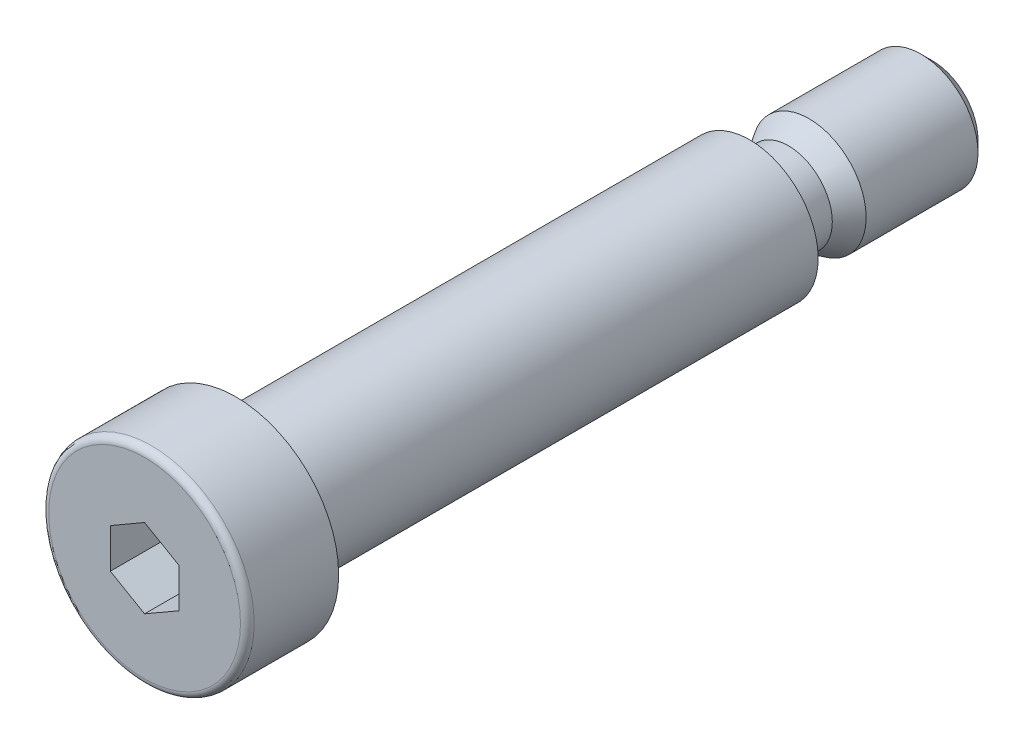
ISO-10303-21;
HEADER;
FILE_DESCRIPTION(('STEP AP214'),'2;1');
FILE_NAME('part.step','',(''),(''),'','','');
FILE_SCHEMA(('AUTOMOTIVE_DESIGN { 1 0 10303 214 1 1 1 1 }'));
ENDSEC;
DATA;
#1=APPLICATION_CONTEXT('core data for automotive mechanical design processes');
#2=APPLICATION_PROTOCOL_DEFINITION('international standard','automotive_design',2000,#1);
#3=PRODUCT_CONTEXT('',#1,'mechanical');
#4=PRODUCT('Part','Part','',(#3));
#5=PRODUCT_RELATED_PRODUCT_CATEGORY('part','',(#4));
#6=PRODUCT_DEFINITION_FORMATION('','',#4);
#7=PRODUCT_DEFINITION_CONTEXT('part definition',#1,'design');
#8=PRODUCT_DEFINITION('design','',#6,#7);
#9=PRODUCT_DEFINITION_SHAPE('','',#8);
#10=(LENGTH_UNIT() NAMED_UNIT(*) SI_UNIT(.MILLI.,.METRE.));
#11=(NAMED_UNIT(*) PLANE_ANGLE_UNIT() SI_UNIT($,.RADIAN.));
#12=(NAMED_UNIT(*) SI_UNIT($,.STERADIAN.) SOLID_ANGLE_UNIT());
#13=UNCERTAINTY_MEASURE_WITH_UNIT(LENGTH_MEASURE(1.E-05),#10,'distance_accuracy_value','');
#14=(GEOMETRIC_REPRESENTATION_CONTEXT(3) GLOBAL_UNCERTAINTY_ASSIGNED_CONTEXT((#13)) GLOBAL_UNIT_ASSIGNED_CONTEXT((#10,
#11,#12)) REPRESENTATION_CONTEXT('',''));
#15=CARTESIAN_POINT('',(0.,0.,0.));
#16=DIRECTION('',(0.,0.,1.));
#17=DIRECTION('',(1.,0.,0.));
#18=AXIS2_PLACEMENT_3D('',#15,#16,#17);
#19=CARTESIAN_POINT('',(0.,0.,30.5));
#20=DIRECTION('',(0.,0.,1.));
#21=DIRECTION('',(1.,0.,0.));
#22=AXIS2_PLACEMENT_3D('',#19,#20,#21);
#23=PLANE('',#22);
#24=CARTESIAN_POINT('',(0.,0.,30.5));
#25=DIRECTION('',(0.,0.,1.));
#26=DIRECTION('',(1.,0.,0.));
#27=AXIS2_PLACEMENT_3D('',#24,#25,#26);
#28=CIRCLE('',#27,8.4);
#29=CARTESIAN_POINT('',(8.4,0.,30.5));
#30=VERTEX_POINT('',#29);
#31=EDGE_CURVE('E42',#30,#30,#28,.T.);
#32=ORIENTED_EDGE('',*,*,#31,.T.);
#33=EDGE_LOOP('',(#32));
#34=FACE_BOUND('',#33,.T.);
#35=DIRECTION('',(0.,1.,0.));
#36=VECTOR('',#35,1.);
#37=CARTESIAN_POINT('',(3.,-1.73205080756888,30.5));
#38=LINE('',#37,#36);
#39=CARTESIAN_POINT('',(3.,-1.73205080756888,30.5));
#40=VERTEX_POINT('',#39);
#41=CARTESIAN_POINT('',(3.,1.73205080756888,30.5));
#42=VERTEX_POINT('',#41);
#43=EDGE_CURVE('E49',#40,#42,#38,.T.);
#44=ORIENTED_EDGE('',*,*,#43,.F.);
#45=DIRECTION('',(0.866025403784439,0.5,0.));
#46=VECTOR('',#45,1.);
#47=CARTESIAN_POINT('',(0.,-3.46410161513775,30.5));
#48=LINE('',#47,#46);
#49=CARTESIAN_POINT('',(0.,-3.46410161513775,30.5));
#50=VERTEX_POINT('',#49);
#51=EDGE_CURVE('E132',#50,#40,#48,.T.);
#52=ORIENTED_EDGE('',*,*,#51,.F.);
#53=DIRECTION('',(0.866025403784439,-0.5,0.));
#54=VECTOR('',#53,1.);
#55=CARTESIAN_POINT('',(-3.,-1.73205080756888,30.5));
#56=LINE('',#55,#54);
#57=CARTESIAN_POINT('',(-3.,-1.73205080756888,30.5));
#58=VERTEX_POINT('',#57);
#59=EDGE_CURVE('E130',#58,#50,#56,.T.);
#60=ORIENTED_EDGE('',*,*,#59,.F.);
#61=DIRECTION('',(0.,-1.,0.));
#62=VECTOR('',#61,1.);
#63=CARTESIAN_POINT('',(-3.,1.73205080756888,30.5));
#64=LINE('',#63,#62);
#65=CARTESIAN_POINT('',(-3.,1.73205080756888,30.5));
#66=VERTEX_POINT('',#65);
#67=EDGE_CURVE('E97',#66,#58,#64,.T.);
#68=ORIENTED_EDGE('',*,*,#67,.F.);
#69=DIRECTION('',(-0.866025403784439,-0.5,0.));
#70=VECTOR('',#69,1.);
#71=CARTESIAN_POINT('',(0.,3.46410161513775,30.5));
#72=LINE('',#71,#70);
#73=CARTESIAN_POINT('',(0.,3.46410161513775,30.5));
#74=VERTEX_POINT('',#73);
#75=EDGE_CURVE('E126',#74,#66,#72,.T.);
#76=ORIENTED_EDGE('',*,*,#75,.F.);
#77=DIRECTION('',(-0.866025403784439,0.5,0.));
#78=VECTOR('',#77,1.);
#79=CARTESIAN_POINT('',(3.,1.73205080756888,30.5));
#80=LINE('',#79,#78);
#81=EDGE_CURVE('E123',#42,#74,#80,.T.);
#82=ORIENTED_EDGE('',*,*,#81,.F.);
#83=EDGE_LOOP('',(#44,#52,#60,#68,#76,#82));
#84=FACE_BOUND('',#83,.T.);
#85=ADVANCED_FACE('F34',(#34,#84),#23,.T.);
#86=CARTESIAN_POINT('',(0.,0.,-38.5));
#87=DIRECTION('',(0.,0.,1.));
#88=DIRECTION('',(1.,0.,0.));
#89=AXIS2_PLACEMENT_3D('',#86,#87,#88);
#90=PLANE('',#89);
#91=CARTESIAN_POINT('',(0.,0.,-38.5));
#92=DIRECTION('',(0.,0.,1.));
#93=DIRECTION('',(1.,0.,0.));
#94=AXIS2_PLACEMENT_3D('',#91,#92,#93);
#95=CIRCLE('',#94,4.);
#96=CARTESIAN_POINT('',(4.,0.,-38.5));
#97=VERTEX_POINT('',#96);
#98=EDGE_CURVE('E162',#97,#97,#95,.T.);
#99=ORIENTED_EDGE('',*,*,#98,.F.);
#100=EDGE_LOOP('',(#99));
#101=FACE_BOUND('',#100,.T.);
#102=ADVANCED_FACE('F178',(#101),#90,.F.);
#103=CARTESIAN_POINT('',(0.,0.,-38.5));
#104=DIRECTION('',(0.,0.,1.));
#105=DIRECTION('',(1.,0.,0.));
#106=AXIS2_PLACEMENT_3D('',#103,#104,#105);
#107=CONICAL_SURFACE('',#106,4.,0.785398163397447);
#108=CARTESIAN_POINT('',(0.,0.,-37.5));
#109=DIRECTION('',(0.,0.,1.));
#110=DIRECTION('',(1.,0.,0.));
#111=AXIS2_PLACEMENT_3D('',#108,#109,#110);
#112=CIRCLE('',#111,5.);
#113=CARTESIAN_POINT('',(5.,0.,-37.5));
#114=VERTEX_POINT('',#113);
#115=EDGE_CURVE('E159',#114,#114,#112,.T.);
#116=ORIENTED_EDGE('',*,*,#115,.F.);
#117=EDGE_LOOP('',(#116));
#118=FACE_BOUND('',#117,.T.);
#119=ORIENTED_EDGE('',*,*,#98,.T.);
#120=EDGE_LOOP('',(#119));
#121=FACE_BOUND('',#120,.T.);
#122=ADVANCED_FACE('F182',(#118,#121),#107,.T.);
#123=CARTESIAN_POINT('',(0.,0.,30.5));
#124=DIRECTION('',(0.,0.,1.));
#125=DIRECTION('',(1.,0.,0.));
#126=AXIS2_PLACEMENT_3D('',#123,#124,#125);
#127=CYLINDRICAL_SURFACE('',#126,5.);
#128=CARTESIAN_POINT('',(0.,0.,-27.7));
#129=DIRECTION('',(0.,0.,1.));
#130=DIRECTION('',(1.,0.,0.));
#131=AXIS2_PLACEMENT_3D('',#128,#129,#130);
#132=CIRCLE('',#131,5.);
#133=CARTESIAN_POINT('',(5.,0.,-27.7));
#134=VERTEX_POINT('',#133);
#135=EDGE_CURVE('E156',#134,#134,#132,.T.);
#136=ORIENTED_EDGE('',*,*,#135,.F.);
#137=EDGE_LOOP('',(#136));
#138=FACE_BOUND('',#137,.T.);
#139=ORIENTED_EDGE('',*,*,#115,.T.);
#140=EDGE_LOOP('',(#139));
#141=FACE_BOUND('',#140,.T.);
#142=ADVANCED_FACE('F188',(#138,#141),#127,.T.);
#143=CARTESIAN_POINT('',(0.,0.,-27.7));
#144=DIRECTION('',(0.,0.,-1.));
#145=DIRECTION('',(-1.,0.,0.));
#146=AXIS2_PLACEMENT_3D('',#143,#144,#145);
#147=CONICAL_SURFACE('',#146,5.,0.566013910063241);
#148=CARTESIAN_POINT('',(0.,0.,-25.89));
#149=DIRECTION('',(0.,0.,1.));
#150=DIRECTION('',(1.,0.,0.));
#151=AXIS2_PLACEMENT_3D('',#148,#149,#150);
#152=CIRCLE('',#151,3.85000000000001);
#153=CARTESIAN_POINT('',(3.85000000000001,0.,-25.89));
#154=VERTEX_POINT('',#153);
#155=EDGE_CURVE('E153',#154,#154,#152,.T.);
#156=ORIENTED_EDGE('',*,*,#155,.F.);
#157=EDGE_LOOP('',(#156));
#158=FACE_BOUND('',#157,.T.);
#159=ORIENTED_EDGE('',*,*,#135,.T.);
#160=EDGE_LOOP('',(#159));
#161=FACE_BOUND('',#160,.T.);
#162=ADVANCED_FACE('F192',(#158,#161),#147,.T.);
#163=CARTESIAN_POINT('',(0.,0.,30.5));
#164=DIRECTION('',(0.,0.,1.));
#165=DIRECTION('',(1.,0.,0.));
#166=AXIS2_PLACEMENT_3D('',#163,#164,#165);
#167=CYLINDRICAL_SURFACE('',#166,3.85000000000001);
#168=ORIENTED_EDGE('',*,*,#155,.T.);
#169=EDGE_LOOP('',(#168));
#170=FACE_BOUND('',#169,.T.);
#171=CARTESIAN_POINT('',(0.,0.,-22.5));
#172=DIRECTION('',(0.,0.,1.));
#173=DIRECTION('',(1.,0.,0.));
#174=AXIS2_PLACEMENT_3D('',#171,#172,#173);
#175=CIRCLE('',#174,3.85000000000001);
#176=CARTESIAN_POINT('',(3.85000000000001,0.,-22.5));
#177=VERTEX_POINT('',#176);
#178=EDGE_CURVE('E150',#177,#177,#175,.T.);
#179=ORIENTED_EDGE('',*,*,#178,.F.);
#180=EDGE_LOOP('',(#179));
#181=FACE_BOUND('',#180,.T.);
#182=ADVANCED_FACE('F196',(#170,#181),#167,.T.);
#183=CARTESIAN_POINT('',(0.,0.,-22.5));
#184=DIRECTION('',(0.,0.,1.));
#185=DIRECTION('',(1.,0.,0.));
#186=AXIS2_PLACEMENT_3D('',#183,#184,#185);
#187=PLANE('',#186);
#188=CARTESIAN_POINT('',(0.,0.,-22.5));
#189=DIRECTION('',(0.,0.,1.));
#190=DIRECTION('',(1.,0.,0.));
#191=AXIS2_PLACEMENT_3D('',#188,#189,#190);
#192=CIRCLE('',#191,6.);
#193=CARTESIAN_POINT('',(6.,0.,-22.5));
#194=VERTEX_POINT('',#193);
#195=EDGE_CURVE('E147',#194,#194,#192,.T.);
#196=ORIENTED_EDGE('',*,*,#195,.F.);
#197=EDGE_LOOP('',(#196));
#198=FACE_BOUND('',#197,.T.);
#199=ORIENTED_EDGE('',*,*,#178,.T.);
#200=EDGE_LOOP('',(#199));
#201=FACE_BOUND('',#200,.T.);
#202=ADVANCED_FACE('F200',(#198,#201),#187,.F.);
#203=CARTESIAN_POINT('',(0.,0.,30.5));
#204=DIRECTION('',(0.,0.,1.));
#205=DIRECTION('',(1.,0.,0.));
#206=AXIS2_PLACEMENT_3D('',#203,#204,#205);
#207=CYLINDRICAL_SURFACE('',#206,6.);
#208=ORIENTED_EDGE('',*,*,#195,.T.);
#209=EDGE_LOOP('',(#208));
#210=FACE_BOUND('',#209,.T.);
#211=CARTESIAN_POINT('',(0.,0.,22.5));
#212=DIRECTION('',(0.,0.,1.));
#213=DIRECTION('',(1.,0.,0.));
#214=AXIS2_PLACEMENT_3D('',#211,#212,#213);
#215=CIRCLE('',#214,6.);
#216=CARTESIAN_POINT('',(6.,0.,22.5));
#217=VERTEX_POINT('',#216);
#218=EDGE_CURVE('E144',#217,#217,#215,.T.);
#219=ORIENTED_EDGE('',*,*,#218,.F.);
#220=EDGE_LOOP('',(#219));
#221=FACE_BOUND('',#220,.T.);
#222=ADVANCED_FACE('F204',(#210,#221),#207,.T.);
#223=CARTESIAN_POINT('',(0.,0.,22.5));
#224=DIRECTION('',(0.,0.,1.));
#225=DIRECTION('',(1.,0.,0.));
#226=AXIS2_PLACEMENT_3D('',#223,#224,#225);
#227=PLANE('',#226);
#228=CARTESIAN_POINT('',(0.,0.,22.5));
#229=DIRECTION('',(0.,0.,1.));
#230=DIRECTION('',(1.,0.,0.));
#231=AXIS2_PLACEMENT_3D('',#228,#229,#230);
#232=CIRCLE('',#231,9.);
#233=CARTESIAN_POINT('',(9.,0.,22.5));
#234=VERTEX_POINT('',#233);
#235=EDGE_CURVE('E136',#234,#234,#232,.T.);
#236=ORIENTED_EDGE('',*,*,#235,.F.);
#237=EDGE_LOOP('',(#236));
#238=FACE_BOUND('',#237,.T.);
#239=ORIENTED_EDGE('',*,*,#218,.T.);
#240=EDGE_LOOP('',(#239));
#241=FACE_BOUND('',#240,.T.);
#242=ADVANCED_FACE('F208',(#238,#241),#227,.F.);
#243=CARTESIAN_POINT('',(0.,0.,30.5));
#244=DIRECTION('',(0.,0.,1.));
#245=DIRECTION('',(1.,0.,0.));
#246=AXIS2_PLACEMENT_3D('',#243,#244,#245);
#247=CYLINDRICAL_SURFACE('',#246,9.);
#248=CARTESIAN_POINT('',(0.,0.,29.9));
#249=DIRECTION('',(0.,0.,1.));
#250=DIRECTION('',(1.,0.,0.));
#251=AXIS2_PLACEMENT_3D('',#248,#249,#250);
#252=CIRCLE('',#251,9.);
#253=CARTESIAN_POINT('',(9.,0.,29.9));
#254=VERTEX_POINT('',#253);
#255=EDGE_CURVE('E11',#254,#254,#252,.F.);
#256=ORIENTED_EDGE('',*,*,#255,.T.);
#257=EDGE_LOOP('',(#256));
#258=FACE_BOUND('',#257,.T.);
#259=ORIENTED_EDGE('',*,*,#235,.T.);
#260=EDGE_LOOP('',(#259));
#261=FACE_BOUND('',#260,.T.);
#262=ADVANCED_FACE('F212',(#258,#261),#247,.T.);
#263=CARTESIAN_POINT('',(3.,-1.73205080756888,25.6));
#264=DIRECTION('',(1.,0.,0.));
#265=DIRECTION('',(0.,1.,0.));
#266=AXIS2_PLACEMENT_3D('',#263,#264,#265);
#267=PLANE('',#266);
#268=ORIENTED_EDGE('',*,*,#43,.T.);
#269=DIRECTION('',(0.,0.,1.));
#270=VECTOR('',#269,1.);
#271=CARTESIAN_POINT('',(3.,1.73205080756888,25.6));
#272=LINE('',#271,#270);
#273=CARTESIAN_POINT('',(3.,1.73205080756888,25.6));
#274=VERTEX_POINT('',#273);
#275=EDGE_CURVE('E79',#274,#42,#272,.T.);
#276=ORIENTED_EDGE('',*,*,#275,.F.);
#277=DIRECTION('',(0.,1.,0.));
#278=VECTOR('',#277,1.);
#279=CARTESIAN_POINT('',(3.,-1.73205080756888,25.6));
#280=LINE('',#279,#278);
#281=CARTESIAN_POINT('',(3.,-1.73205080756888,25.6));
#282=VERTEX_POINT('',#281);
#283=EDGE_CURVE('E134',#282,#274,#280,.T.);
#284=ORIENTED_EDGE('',*,*,#283,.F.);
#285=DIRECTION('',(0.,0.,1.));
#286=VECTOR('',#285,1.);
#287=CARTESIAN_POINT('',(3.,-1.73205080756888,25.6));
#288=LINE('',#287,#286);
#289=EDGE_CURVE('E57',#282,#40,#288,.T.);
#290=ORIENTED_EDGE('',*,*,#289,.T.);
#291=EDGE_LOOP('',(#268,#276,#284,#290));
#292=FACE_BOUND('',#291,.T.);
#293=ADVANCED_FACE('F216',(#292),#267,.F.);
#294=CARTESIAN_POINT('',(0.,-3.46410161513775,25.6));
#295=DIRECTION('',(0.5,-0.866025403784439,0.));
#296=DIRECTION('',(0.866025403784439,0.5,0.));
#297=AXIS2_PLACEMENT_3D('',#294,#295,#296);
#298=PLANE('',#297);
#299=ORIENTED_EDGE('',*,*,#51,.T.);
#300=ORIENTED_EDGE('',*,*,#289,.F.);
#301=DIRECTION('',(0.866025403784439,0.5,0.));
#302=VECTOR('',#301,1.);
#303=CARTESIAN_POINT('',(0.,-3.46410161513775,25.6));
#304=LINE('',#303,#302);
#305=CARTESIAN_POINT('',(0.,-3.46410161513775,25.6));
#306=VERTEX_POINT('',#305);
#307=EDGE_CURVE('E109',#306,#282,#304,.T.);
#308=ORIENTED_EDGE('',*,*,#307,.F.);
#309=DIRECTION('',(0.,0.,1.));
#310=VECTOR('',#309,1.);
#311=CARTESIAN_POINT('',(0.,-3.46410161513775,25.6));
#312=LINE('',#311,#310);
#313=EDGE_CURVE('E101',#306,#50,#312,.T.);
#314=ORIENTED_EDGE('',*,*,#313,.T.);
#315=EDGE_LOOP('',(#299,#300,#308,#314));
#316=FACE_BOUND('',#315,.T.);
#317=ADVANCED_FACE('F220',(#316),#298,.F.);
#318=CARTESIAN_POINT('',(-3.,-1.73205080756888,25.6));
#319=DIRECTION('',(-0.5,-0.866025403784439,0.));
#320=DIRECTION('',(0.866025403784439,-0.5,0.));
#321=AXIS2_PLACEMENT_3D('',#318,#319,#320);
#322=PLANE('',#321);
#323=ORIENTED_EDGE('',*,*,#59,.T.);
#324=ORIENTED_EDGE('',*,*,#313,.F.);
#325=DIRECTION('',(0.866025403784439,-0.5,0.));
#326=VECTOR('',#325,1.);
#327=CARTESIAN_POINT('',(-3.,-1.73205080756888,25.6));
#328=LINE('',#327,#326);
#329=CARTESIAN_POINT('',(-3.,-1.73205080756888,25.6));
#330=VERTEX_POINT('',#329);
#331=EDGE_CURVE('E105',#330,#306,#328,.T.);
#332=ORIENTED_EDGE('',*,*,#331,.F.);
#333=DIRECTION('',(0.,0.,1.));
#334=VECTOR('',#333,1.);
#335=CARTESIAN_POINT('',(-3.,-1.73205080756888,25.6));
#336=LINE('',#335,#334);
#337=EDGE_CURVE('E90',#330,#58,#336,.T.);
#338=ORIENTED_EDGE('',*,*,#337,.T.);
#339=EDGE_LOOP('',(#323,#324,#332,#338));
#340=FACE_BOUND('',#339,.T.);
#341=ADVANCED_FACE('F106',(#340),#322,.F.);
#342=CARTESIAN_POINT('',(-3.,1.73205080756888,25.6));
#343=DIRECTION('',(-1.,0.,0.));
#344=DIRECTION('',(0.,0.,1.));
#345=AXIS2_PLACEMENT_3D('',#342,#343,#344);
#346=PLANE('',#345);
#347=ORIENTED_EDGE('',*,*,#67,.T.);
#348=ORIENTED_EDGE('',*,*,#337,.F.);
#349=DIRECTION('',(0.,-1.,0.));
#350=VECTOR('',#349,1.);
#351=CARTESIAN_POINT('',(-3.,1.73205080756888,25.6));
#352=LINE('',#351,#350);
#353=CARTESIAN_POINT('',(-3.,1.73205080756888,25.6));
#354=VERTEX_POINT('',#353);
#355=EDGE_CURVE('E94',#354,#330,#352,.T.);
#356=ORIENTED_EDGE('',*,*,#355,.F.);
#357=DIRECTION('',(0.,0.,1.));
#358=VECTOR('',#357,1.);
#359=CARTESIAN_POINT('',(-3.,1.73205080756888,25.6));
#360=LINE('',#359,#358);
#361=EDGE_CURVE('E102',#354,#66,#360,.T.);
#362=ORIENTED_EDGE('',*,*,#361,.T.);
#363=EDGE_LOOP('',(#347,#348,#356,#362));
#364=FACE_BOUND('',#363,.T.);
#365=ADVANCED_FACE('F92',(#364),#346,.F.);
#366=CARTESIAN_POINT('',(0.,3.46410161513775,25.6));
#367=DIRECTION('',(-0.5,0.866025403784439,0.));
#368=DIRECTION('',(-0.866025403784439,-0.5,0.));
#369=AXIS2_PLACEMENT_3D('',#366,#367,#368);
#370=PLANE('',#369);
#371=ORIENTED_EDGE('',*,*,#75,.T.);
#372=ORIENTED_EDGE('',*,*,#361,.F.);
#373=DIRECTION('',(-0.866025403784439,-0.5,0.));
#374=VECTOR('',#373,1.);
#375=CARTESIAN_POINT('',(0.,3.46410161513775,25.6));
#376=LINE('',#375,#374);
#377=CARTESIAN_POINT('',(0.,3.46410161513775,25.6));
#378=VERTEX_POINT('',#377);
#379=EDGE_CURVE('E115',#378,#354,#376,.T.);
#380=ORIENTED_EDGE('',*,*,#379,.F.);
#381=DIRECTION('',(0.,0.,1.));
#382=VECTOR('',#381,1.);
#383=CARTESIAN_POINT('',(0.,3.46410161513775,25.6));
#384=LINE('',#383,#382);
#385=EDGE_CURVE('E139',#378,#74,#384,.T.);
#386=ORIENTED_EDGE('',*,*,#385,.T.);
#387=EDGE_LOOP('',(#371,#372,#380,#386));
#388=FACE_BOUND('',#387,.T.);
#389=ADVANCED_FACE('F223',(#388),#370,.F.);
#390=CARTESIAN_POINT('',(3.,1.73205080756888,25.6));
#391=DIRECTION('',(0.5,0.866025403784439,0.));
#392=DIRECTION('',(-0.866025403784439,0.5,0.));
#393=AXIS2_PLACEMENT_3D('',#390,#391,#392);
#394=PLANE('',#393);
#395=ORIENTED_EDGE('',*,*,#81,.T.);
#396=ORIENTED_EDGE('',*,*,#385,.F.);
#397=DIRECTION('',(-0.866025403784439,0.5,0.));
#398=VECTOR('',#397,1.);
#399=CARTESIAN_POINT('',(3.,1.73205080756888,25.6));
#400=LINE('',#399,#398);
#401=EDGE_CURVE('E117',#274,#378,#400,.T.);
#402=ORIENTED_EDGE('',*,*,#401,.F.);
#403=ORIENTED_EDGE('',*,*,#275,.T.);
#404=EDGE_LOOP('',(#395,#396,#402,#403));
#405=FACE_BOUND('',#404,.T.);
#406=ADVANCED_FACE('F174',(#405),#394,.F.);
#407=CARTESIAN_POINT('',(0.,0.,25.6));
#408=DIRECTION('',(0.,0.,1.));
#409=DIRECTION('',(1.,0.,0.));
#410=AXIS2_PLACEMENT_3D('',#407,#408,#409);
#411=PLANE('',#410);
#412=ORIENTED_EDGE('',*,*,#283,.T.);
#413=ORIENTED_EDGE('',*,*,#401,.T.);
#414=ORIENTED_EDGE('',*,*,#379,.T.);
#415=ORIENTED_EDGE('',*,*,#355,.T.);
#416=ORIENTED_EDGE('',*,*,#331,.T.);
#417=ORIENTED_EDGE('',*,*,#307,.T.);
#418=EDGE_LOOP('',(#412,#413,#414,#415,#416,#417));
#419=FACE_BOUND('',#418,.T.);
#420=ADVANCED_FACE('F112',(#419),#411,.T.);
#421=CARTESIAN_POINT('',(0.,0.,29.9));
#422=DIRECTION('',(0.,0.,1.));
#423=DIRECTION('',(1.,0.,0.));
#424=AXIS2_PLACEMENT_3D('',#421,#422,#423);
#425=TOROIDAL_SURFACE('',#424,8.4,0.6);
#426=ORIENTED_EDGE('',*,*,#255,.F.);
#427=EDGE_LOOP('',(#426));
#428=FACE_BOUND('',#427,.T.);
#429=ORIENTED_EDGE('',*,*,#31,.F.);
#430=EDGE_LOOP('',(#429));
#431=FACE_BOUND('',#430,.T.);
#432=ADVANCED_FACE('F36',(#428,#431),#425,.T.);
#433=CLOSED_SHELL('',(#85,#102,#122,#142,#162,#182,#202,#222,#242,#262,#293,#317,#341,#365,#389,
#406,#420,#432));
#434=MANIFOLD_SOLID_BREP('B2',#433);
#435=ADVANCED_BREP_SHAPE_REPRESENTATION('',(#18,#434),#14);
#436=SHAPE_DEFINITION_REPRESENTATION(#9,#435);
ENDSEC;
END-ISO-10303-21;
